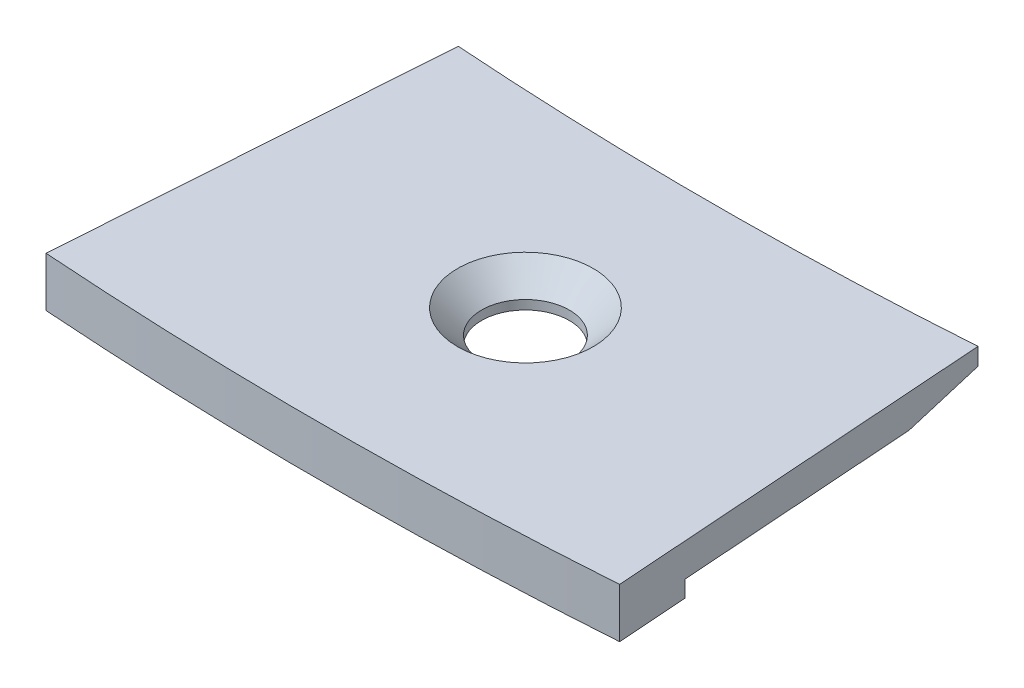
ISO-10303-21;
HEADER;
FILE_DESCRIPTION(('STEP AP214'),'2;1');
FILE_NAME('part.step','',(''),(''),'','','');
FILE_SCHEMA(('AUTOMOTIVE_DESIGN { 1 0 10303 214 1 1 1 1 }'));
ENDSEC;
DATA;
#1=APPLICATION_CONTEXT('core data for automotive mechanical design processes');
#2=APPLICATION_PROTOCOL_DEFINITION('international standard','automotive_design',2000,#1);
#3=PRODUCT_CONTEXT('',#1,'mechanical');
#4=PRODUCT('Part','Part','',(#3));
#5=PRODUCT_RELATED_PRODUCT_CATEGORY('part','',(#4));
#6=PRODUCT_DEFINITION_FORMATION('','',#4);
#7=PRODUCT_DEFINITION_CONTEXT('part definition',#1,'design');
#8=PRODUCT_DEFINITION('design','',#6,#7);
#9=PRODUCT_DEFINITION_SHAPE('','',#8);
#10=(LENGTH_UNIT() NAMED_UNIT(*) SI_UNIT(.MILLI.,.METRE.));
#11=(NAMED_UNIT(*) PLANE_ANGLE_UNIT() SI_UNIT($,.RADIAN.));
#12=(NAMED_UNIT(*) SI_UNIT($,.STERADIAN.) SOLID_ANGLE_UNIT());
#13=UNCERTAINTY_MEASURE_WITH_UNIT(LENGTH_MEASURE(1.E-05),#10,'distance_accuracy_value','');
#14=(GEOMETRIC_REPRESENTATION_CONTEXT(3) GLOBAL_UNCERTAINTY_ASSIGNED_CONTEXT((#13)) GLOBAL_UNIT_ASSIGNED_CONTEXT((#10,
#11,#12)) REPRESENTATION_CONTEXT('',''));
#15=CARTESIAN_POINT('',(0.,0.,0.));
#16=DIRECTION('',(0.,0.,1.));
#17=DIRECTION('',(1.,0.,0.));
#18=AXIS2_PLACEMENT_3D('',#15,#16,#17);
#19=CARTESIAN_POINT('',(-4.35114280077257E-12,0.,3.66381025475767E-12));
#20=DIRECTION('',(0.,-1.,0.));
#21=DIRECTION('',(0.,0.,-1.));
#22=AXIS2_PLACEMENT_3D('',#19,#20,#21);
#23=PLANE('',#22);
#24=CARTESIAN_POINT('',(0.,0.,236.25));
#25=DIRECTION('',(0.,1.,0.));
#26=DIRECTION('',(0.,0.,1.));
#27=AXIS2_PLACEMENT_3D('',#24,#25,#26);
#28=CIRCLE('',#27,2.65);
#29=CARTESIAN_POINT('',(0.,0.,238.9));
#30=VERTEX_POINT('',#29);
#31=EDGE_CURVE('E128',#30,#30,#28,.T.);
#32=ORIENTED_EDGE('',*,*,#31,.T.);
#33=EDGE_LOOP('',(#32));
#34=FACE_BOUND('',#33,.T.);
#35=CARTESIAN_POINT('',(0.,0.,0.));
#36=DIRECTION('',(0.,1.,0.));
#37=DIRECTION('',(0.,0.,1.));
#38=AXIS2_PLACEMENT_3D('',#35,#36,#37);
#39=CIRCLE('',#38,244.25);
#40=CARTESIAN_POINT('',(-17.0380187120024,0.,243.655019275962));
#41=VERTEX_POINT('',#40);
#42=CARTESIAN_POINT('',(17.0380187120027,0.,243.655019275962));
#43=VERTEX_POINT('',#42);
#44=EDGE_CURVE('E52',#41,#43,#39,.T.);
#45=ORIENTED_EDGE('',*,*,#44,.F.);
#46=DIRECTION('',(-0.0697564737441075,0.,0.997564050259826));
#47=VECTOR('',#46,1.);
#48=CARTESIAN_POINT('',(-15.9846959584666,0.,228.591802117042));
#49=LINE('',#48,#47);
#50=CARTESIAN_POINT('',(-16.0195741953386,0.,229.090584142172));
#51=VERTEX_POINT('',#50);
#52=EDGE_CURVE('E132',#51,#41,#49,.T.);
#53=ORIENTED_EDGE('',*,*,#52,.F.);
#54=CARTESIAN_POINT('',(0.,0.,0.));
#55=DIRECTION('',(0.,-1.,0.));
#56=DIRECTION('',(0.,0.,-1.));
#57=AXIS2_PLACEMENT_3D('',#54,#55,#56);
#58=CIRCLE('',#57,229.650000000004);
#59=CARTESIAN_POINT('',(16.0195741953387,0.,229.090584142172));
#60=VERTEX_POINT('',#59);
#61=EDGE_CURVE('E45',#51,#60,#58,.F.);
#62=ORIENTED_EDGE('',*,*,#61,.T.);
#63=DIRECTION('',(-0.0697564737441094,0.,-0.997564050259825));
#64=VECTOR('',#63,1.);
#65=CARTESIAN_POINT('',(15.9846959584666,0.,228.591802117042));
#66=LINE('',#65,#64);
#67=EDGE_CURVE('E58',#43,#60,#66,.T.);
#68=ORIENTED_EDGE('',*,*,#67,.F.);
#69=EDGE_LOOP('',(#45,#53,#62,#68));
#70=FACE_BOUND('',#69,.T.);
#71=ADVANCED_FACE('F35',(#34,#70),#23,.T.);
#72=CARTESIAN_POINT('',(-4.35114280077257E-12,2.,3.66381025475767E-12));
#73=DIRECTION('',(0.,-1.,0.));
#74=DIRECTION('',(0.,0.,-1.));
#75=AXIS2_PLACEMENT_3D('',#72,#73,#74);
#76=PLANE('',#75);
#77=CARTESIAN_POINT('',(0.,2.,236.25));
#78=DIRECTION('',(0.,1.,0.));
#79=DIRECTION('',(0.,0.,1.));
#80=AXIS2_PLACEMENT_3D('',#77,#78,#79);
#81=CIRCLE('',#80,4.1);
#82=CARTESIAN_POINT('',(0.,2.,240.35));
#83=VERTEX_POINT('',#82);
#84=EDGE_CURVE('E169',#83,#83,#81,.T.);
#85=ORIENTED_EDGE('',*,*,#84,.F.);
#86=EDGE_LOOP('',(#85));
#87=FACE_BOUND('',#86,.T.);
#88=DIRECTION('',(-0.0697564737441094,0.,-0.997564050259825));
#89=VECTOR('',#88,1.);
#90=CARTESIAN_POINT('',(15.9846959584666,2.,228.591802117042));
#91=LINE('',#90,#89);
#92=CARTESIAN_POINT('',(17.3344837254152,2.,247.894666489571));
#93=VERTEX_POINT('',#92);
#94=CARTESIAN_POINT('',(15.7056700634855,2.,224.601545916003));
#95=VERTEX_POINT('',#94);
#96=EDGE_CURVE('E137',#93,#95,#91,.T.);
#97=ORIENTED_EDGE('',*,*,#96,.T.);
#98=CARTESIAN_POINT('',(0.,2.,0.));
#99=DIRECTION('',(0.,-1.,0.));
#100=DIRECTION('',(0.,0.,-1.));
#101=AXIS2_PLACEMENT_3D('',#98,#99,#100);
#102=CIRCLE('',#101,225.150000000004);
#103=CARTESIAN_POINT('',(-15.7056700634945,2.,224.601545916003));
#104=VERTEX_POINT('',#103);
#105=EDGE_CURVE('E117',#95,#104,#102,.T.);
#106=ORIENTED_EDGE('',*,*,#105,.T.);
#107=DIRECTION('',(-0.0697564737441075,0.,0.997564050259826));
#108=VECTOR('',#107,1.);
#109=CARTESIAN_POINT('',(-15.9846959584666,2.,228.591802117042));
#110=LINE('',#109,#108);
#111=CARTESIAN_POINT('',(-17.3344837254152,2.,247.894666489571));
#112=VERTEX_POINT('',#111);
#113=EDGE_CURVE('E133',#104,#112,#110,.T.);
#114=ORIENTED_EDGE('',*,*,#113,.T.);
#115=CARTESIAN_POINT('',(-4.6074255521944E-12,2.,0.));
#116=DIRECTION('',(0.,1.,0.));
#117=DIRECTION('',(0.,0.,-1.));
#118=AXIS2_PLACEMENT_3D('',#115,#116,#117);
#119=CIRCLE('',#118,248.500000000005);
#120=EDGE_CURVE('E135',#112,#93,#119,.T.);
#121=ORIENTED_EDGE('',*,*,#120,.T.);
#122=EDGE_LOOP('',(#97,#106,#114,#121));
#123=FACE_BOUND('',#122,.T.);
#124=ADVANCED_FACE('F161',(#87,#123),#76,.F.);
#125=CARTESIAN_POINT('',(-15.9846959584666,2.,228.591802117042));
#126=DIRECTION('',(0.997564050259826,0.,0.0697564737441075));
#127=DIRECTION('',(0.0697564737441075,0.,-0.997564050259826));
#128=AXIS2_PLACEMENT_3D('',#125,#126,#127);
#129=PLANE('',#128);
#130=DIRECTION('',(0.,1.,0.));
#131=VECTOR('',#130,1.);
#132=CARTESIAN_POINT('',(-15.7056700634945,0.,224.601545916003));
#133=LINE('',#132,#131);
#134=CARTESIAN_POINT('',(-15.7056700634945,0.956504527515105,224.601545916003));
#135=VERTEX_POINT('',#134);
#136=EDGE_CURVE('E126',#135,#104,#133,.T.);
#137=ORIENTED_EDGE('',*,*,#136,.F.);
#138=DIRECTION('',(-0.0682321274284495,-0.207911690817758,0.975764882339946));
#139=VECTOR('',#138,1.);
#140=CARTESIAN_POINT('',(-4.09781873540611E-12,48.813614387521,-2.86547400089263E-13));
#141=LINE('',#140,#139);
#142=EDGE_CURVE('E148',#135,#51,#141,.T.);
#143=ORIENTED_EDGE('',*,*,#142,.T.);
#144=ORIENTED_EDGE('',*,*,#52,.T.);
#145=DIRECTION('',(0.,1.,0.));
#146=VECTOR('',#145,1.);
#147=CARTESIAN_POINT('',(-17.0380187120023,-1.,243.655019275962));
#148=LINE('',#147,#146);
#149=CARTESIAN_POINT('',(-17.0380187120023,-1.,243.655019275962));
#150=VERTEX_POINT('',#149);
#151=EDGE_CURVE('E118',#150,#41,#148,.T.);
#152=ORIENTED_EDGE('',*,*,#151,.F.);
#153=DIRECTION('',(0.0697564737441085,0.,-0.997564050259825));
#154=VECTOR('',#153,1.);
#155=CARTESIAN_POINT('',(-17.3344837254152,-1.,247.894666489571));
#156=LINE('',#155,#154);
#157=CARTESIAN_POINT('',(-17.3344837254152,-1.,247.894666489571));
#158=VERTEX_POINT('',#157);
#159=EDGE_CURVE('E111',#158,#150,#156,.T.);
#160=ORIENTED_EDGE('',*,*,#159,.F.);
#161=DIRECTION('',(0.,-1.,0.));
#162=VECTOR('',#161,1.);
#163=CARTESIAN_POINT('',(-17.3344837254152,2.,247.894666489571));
#164=LINE('',#163,#162);
#165=EDGE_CURVE('E143',#112,#158,#164,.T.);
#166=ORIENTED_EDGE('',*,*,#165,.F.);
#167=ORIENTED_EDGE('',*,*,#113,.F.);
#168=EDGE_LOOP('',(#137,#143,#144,#152,#160,#166,#167));
#169=FACE_BOUND('',#168,.T.);
#170=ADVANCED_FACE('F179',(#169),#129,.F.);
#171=CARTESIAN_POINT('',(-4.6074255521944E-12,2.,0.));
#172=DIRECTION('',(0.,-1.,0.));
#173=DIRECTION('',(0.,0.,-1.));
#174=AXIS2_PLACEMENT_3D('',#171,#172,#173);
#175=CYLINDRICAL_SURFACE('',#174,248.500000000005);
#176=ORIENTED_EDGE('',*,*,#165,.T.);
#177=CARTESIAN_POINT('',(0.,-1.,0.));
#178=DIRECTION('',(0.,-1.,0.));
#179=DIRECTION('',(0.,0.,1.));
#180=AXIS2_PLACEMENT_3D('',#177,#178,#179);
#181=CIRCLE('',#180,248.500000000005);
#182=CARTESIAN_POINT('',(17.3344837254153,-1.,247.894666489571));
#183=VERTEX_POINT('',#182);
#184=EDGE_CURVE('E105',#183,#158,#181,.T.);
#185=ORIENTED_EDGE('',*,*,#184,.F.);
#186=DIRECTION('',(0.,-1.,0.));
#187=VECTOR('',#186,1.);
#188=CARTESIAN_POINT('',(17.3344837254152,2.,247.894666489571));
#189=LINE('',#188,#187);
#190=EDGE_CURVE('E101',#93,#183,#189,.T.);
#191=ORIENTED_EDGE('',*,*,#190,.F.);
#192=ORIENTED_EDGE('',*,*,#120,.F.);
#193=EDGE_LOOP('',(#176,#185,#191,#192));
#194=FACE_BOUND('',#193,.T.);
#195=ADVANCED_FACE('F165',(#194),#175,.T.);
#196=CARTESIAN_POINT('',(15.9846959584666,2.,228.591802117042));
#197=DIRECTION('',(-0.997564050259825,0.,0.0697564737441094));
#198=DIRECTION('',(0.0697564737441094,0.,0.997564050259825));
#199=AXIS2_PLACEMENT_3D('',#196,#197,#198);
#200=PLANE('',#199);
#201=ORIENTED_EDGE('',*,*,#190,.T.);
#202=DIRECTION('',(0.0697564737440471,0.,0.99756405025983));
#203=VECTOR('',#202,1.);
#204=CARTESIAN_POINT('',(17.3344837254152,-1.,247.894666489571));
#205=LINE('',#204,#203);
#206=CARTESIAN_POINT('',(17.0380187120027,-1.,243.655019275962));
#207=VERTEX_POINT('',#206);
#208=EDGE_CURVE('E94',#207,#183,#205,.T.);
#209=ORIENTED_EDGE('',*,*,#208,.F.);
#210=DIRECTION('',(0.,1.,0.));
#211=VECTOR('',#210,1.);
#212=CARTESIAN_POINT('',(17.0380187120027,-1.,243.655019275962));
#213=LINE('',#212,#211);
#214=EDGE_CURVE('E98',#207,#43,#213,.T.);
#215=ORIENTED_EDGE('',*,*,#214,.T.);
#216=ORIENTED_EDGE('',*,*,#67,.T.);
#217=DIRECTION('',(-0.0682321274284514,0.207911690817758,-0.975764882339946));
#218=VECTOR('',#217,1.);
#219=CARTESIAN_POINT('',(3.74479718894375E-12,48.813614387521,-2.61861728797796E-13));
#220=LINE('',#219,#218);
#221=CARTESIAN_POINT('',(15.7056700634855,0.956504527515105,224.601545916003));
#222=VERTEX_POINT('',#221);
#223=EDGE_CURVE('E11',#60,#222,#220,.T.);
#224=ORIENTED_EDGE('',*,*,#223,.T.);
#225=DIRECTION('',(0.,1.,0.));
#226=VECTOR('',#225,1.);
#227=CARTESIAN_POINT('',(15.7056700634855,0.,224.601545916003));
#228=LINE('',#227,#226);
#229=EDGE_CURVE('E121',#222,#95,#228,.T.);
#230=ORIENTED_EDGE('',*,*,#229,.T.);
#231=ORIENTED_EDGE('',*,*,#96,.F.);
#232=EDGE_LOOP('',(#201,#209,#215,#216,#224,#230,#231));
#233=FACE_BOUND('',#232,.T.);
#234=ADVANCED_FACE('F96',(#233),#200,.F.);
#235=CARTESIAN_POINT('',(0.,2.,236.25));
#236=DIRECTION('',(0.,-1.,0.));
#237=DIRECTION('',(0.,0.,-1.));
#238=AXIS2_PLACEMENT_3D('',#235,#236,#237);
#239=CYLINDRICAL_SURFACE('',#238,2.65);
#240=CARTESIAN_POINT('',(0.,0.550000000000005,236.25));
#241=DIRECTION('',(0.,1.,0.));
#242=DIRECTION('',(0.,0.,1.));
#243=AXIS2_PLACEMENT_3D('',#240,#241,#242);
#244=CIRCLE('',#243,2.65);
#245=CARTESIAN_POINT('',(0.,0.550000000000005,238.9));
#246=VERTEX_POINT('',#245);
#247=EDGE_CURVE('E40',#246,#246,#244,.F.);
#248=ORIENTED_EDGE('',*,*,#247,.F.);
#249=EDGE_LOOP('',(#248));
#250=FACE_BOUND('',#249,.T.);
#251=ORIENTED_EDGE('',*,*,#31,.F.);
#252=EDGE_LOOP('',(#251));
#253=FACE_BOUND('',#252,.T.);
#254=ADVANCED_FACE('F189',(#250,#253),#239,.F.);
#255=CARTESIAN_POINT('',(0.,0.,0.));
#256=DIRECTION('',(0.,1.,0.));
#257=DIRECTION('',(0.,0.,1.));
#258=AXIS2_PLACEMENT_3D('',#255,#256,#257);
#259=CYLINDRICAL_SURFACE('',#258,225.150000000004);
#260=ORIENTED_EDGE('',*,*,#229,.F.);
#261=CARTESIAN_POINT('',(0.,0.956504527515105,0.));
#262=DIRECTION('',(0.,-1.,0.));
#263=DIRECTION('',(0.,0.,-1.));
#264=AXIS2_PLACEMENT_3D('',#261,#262,#263);
#265=CIRCLE('',#264,225.150000000004);
#266=EDGE_CURVE('E145',#222,#135,#265,.T.);
#267=ORIENTED_EDGE('',*,*,#266,.T.);
#268=ORIENTED_EDGE('',*,*,#136,.T.);
#269=ORIENTED_EDGE('',*,*,#105,.F.);
#270=EDGE_LOOP('',(#260,#267,#268,#269));
#271=FACE_BOUND('',#270,.T.);
#272=ADVANCED_FACE('F157',(#271),#259,.F.);
#273=CARTESIAN_POINT('',(0.,0.956504527515105,0.));
#274=DIRECTION('',(0.,-1.,0.));
#275=DIRECTION('',(0.,0.,-1.));
#276=AXIS2_PLACEMENT_3D('',#273,#274,#275);
#277=CONICAL_SURFACE('',#276,225.150000000004,1.36135681655558);
#278=ORIENTED_EDGE('',*,*,#223,.F.);
#279=ORIENTED_EDGE('',*,*,#61,.F.);
#280=ORIENTED_EDGE('',*,*,#142,.F.);
#281=ORIENTED_EDGE('',*,*,#266,.F.);
#282=EDGE_LOOP('',(#278,#279,#280,#281));
#283=FACE_BOUND('',#282,.T.);
#284=ADVANCED_FACE('F38',(#283),#277,.F.);
#285=CARTESIAN_POINT('',(0.,-1.,0.));
#286=DIRECTION('',(0.,1.,0.));
#287=DIRECTION('',(0.,0.,1.));
#288=AXIS2_PLACEMENT_3D('',#285,#286,#287);
#289=CYLINDRICAL_SURFACE('',#288,244.25);
#290=ORIENTED_EDGE('',*,*,#44,.T.);
#291=ORIENTED_EDGE('',*,*,#214,.F.);
#292=CARTESIAN_POINT('',(0.,-1.,0.));
#293=DIRECTION('',(0.,1.,0.));
#294=DIRECTION('',(0.,0.,1.));
#295=AXIS2_PLACEMENT_3D('',#292,#293,#294);
#296=CIRCLE('',#295,244.25);
#297=EDGE_CURVE('E106',#150,#207,#296,.T.);
#298=ORIENTED_EDGE('',*,*,#297,.F.);
#299=ORIENTED_EDGE('',*,*,#151,.T.);
#300=EDGE_LOOP('',(#290,#291,#298,#299));
#301=FACE_BOUND('',#300,.T.);
#302=ADVANCED_FACE('F116',(#301),#289,.F.);
#303=CARTESIAN_POINT('',(0.,-1.,0.));
#304=DIRECTION('',(0.,1.,0.));
#305=DIRECTION('',(0.,0.,1.));
#306=AXIS2_PLACEMENT_3D('',#303,#304,#305);
#307=PLANE('',#306);
#308=ORIENTED_EDGE('',*,*,#297,.T.);
#309=ORIENTED_EDGE('',*,*,#208,.T.);
#310=ORIENTED_EDGE('',*,*,#184,.T.);
#311=ORIENTED_EDGE('',*,*,#159,.T.);
#312=EDGE_LOOP('',(#308,#309,#310,#311));
#313=FACE_BOUND('',#312,.T.);
#314=ADVANCED_FACE('F109',(#313),#307,.F.);
#315=CARTESIAN_POINT('',(0.,2.,236.25));
#316=DIRECTION('',(0.,1.,0.));
#317=DIRECTION('',(0.,0.,1.));
#318=AXIS2_PLACEMENT_3D('',#315,#316,#317);
#319=CONICAL_SURFACE('',#318,4.1,0.785398163397449);
#320=ORIENTED_EDGE('',*,*,#247,.T.);
#321=EDGE_LOOP('',(#320));
#322=FACE_BOUND('',#321,.T.);
#323=ORIENTED_EDGE('',*,*,#84,.T.);
#324=EDGE_LOOP('',(#323));
#325=FACE_BOUND('',#324,.T.);
#326=ADVANCED_FACE('F176',(#322,#325),#319,.F.);
#327=CLOSED_SHELL('',(#71,#124,#170,#195,#234,#254,#272,#284,#302,#314,#326));
#328=MANIFOLD_SOLID_BREP('B2',#327);
#329=ADVANCED_BREP_SHAPE_REPRESENTATION('',(#18,#328),#14);
#330=SHAPE_DEFINITION_REPRESENTATION(#9,#329);
ENDSEC;
END-ISO-10303-21;
